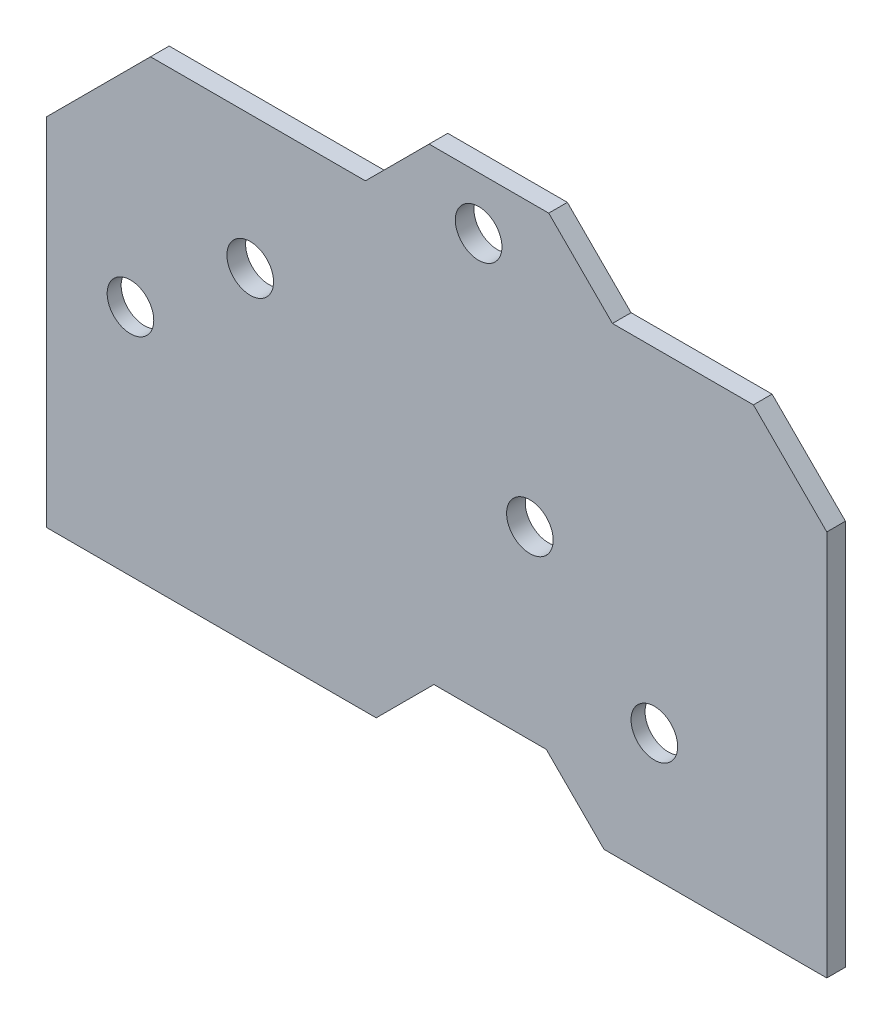
ISO-10303-21;
HEADER;
FILE_DESCRIPTION(('STEP AP214'),'2;1');
FILE_NAME('part.step','',(''),(''),'','','');
FILE_SCHEMA(('AUTOMOTIVE_DESIGN { 1 0 10303 214 1 1 1 1 }'));
ENDSEC;
DATA;
#1=APPLICATION_CONTEXT('core data for automotive mechanical design processes');
#2=APPLICATION_PROTOCOL_DEFINITION('international standard','automotive_design',2000,#1);
#3=PRODUCT_CONTEXT('',#1,'mechanical');
#4=PRODUCT('Part','Part','',(#3));
#5=PRODUCT_RELATED_PRODUCT_CATEGORY('part','',(#4));
#6=PRODUCT_DEFINITION_FORMATION('','',#4);
#7=PRODUCT_DEFINITION_CONTEXT('part definition',#1,'design');
#8=PRODUCT_DEFINITION('design','',#6,#7);
#9=PRODUCT_DEFINITION_SHAPE('','',#8);
#10=(LENGTH_UNIT() NAMED_UNIT(*) SI_UNIT(.MILLI.,.METRE.));
#11=(NAMED_UNIT(*) PLANE_ANGLE_UNIT() SI_UNIT($,.RADIAN.));
#12=(NAMED_UNIT(*) SI_UNIT($,.STERADIAN.) SOLID_ANGLE_UNIT());
#13=UNCERTAINTY_MEASURE_WITH_UNIT(LENGTH_MEASURE(1.E-05),#10,'distance_accuracy_value','');
#14=(GEOMETRIC_REPRESENTATION_CONTEXT(3) GLOBAL_UNCERTAINTY_ASSIGNED_CONTEXT((#13)) GLOBAL_UNIT_ASSIGNED_CONTEXT((#10,
#11,#12)) REPRESENTATION_CONTEXT('',''));
#15=CARTESIAN_POINT('',(0.,0.,0.));
#16=DIRECTION('',(0.,0.,1.));
#17=DIRECTION('',(1.,0.,0.));
#18=AXIS2_PLACEMENT_3D('',#15,#16,#17);
#19=CARTESIAN_POINT('',(22.1496803835065,-14.6968673144949,2.));
#20=DIRECTION('',(0.,0.,-1.));
#21=DIRECTION('',(-1.,0.,0.));
#22=AXIS2_PLACEMENT_3D('',#19,#20,#21);
#23=CYLINDRICAL_SURFACE('',#22,5.2);
#24=CARTESIAN_POINT('',(22.1496803835065,-14.6968673144949,0.));
#25=DIRECTION('',(0.,0.,1.));
#26=DIRECTION('',(1.,0.,0.));
#27=AXIS2_PLACEMENT_3D('',#24,#25,#26);
#28=CIRCLE('',#27,5.2);
#29=CARTESIAN_POINT('',(27.3496803835065,-14.6968673144949,0.));
#30=VERTEX_POINT('',#29);
#31=EDGE_CURVE('E164',#30,#30,#28,.T.);
#32=ORIENTED_EDGE('',*,*,#31,.F.);
#33=EDGE_LOOP('',(#32));
#34=FACE_BOUND('',#33,.T.);
#35=CARTESIAN_POINT('',(22.1496803835065,-14.6968673144949,0.5));
#36=DIRECTION('',(0.,0.,1.));
#37=DIRECTION('',(1.,0.,0.));
#38=AXIS2_PLACEMENT_3D('',#35,#36,#37);
#39=CIRCLE('',#38,5.2);
#40=CARTESIAN_POINT('',(27.3496803835065,-14.6968673144949,0.5));
#41=VERTEX_POINT('',#40);
#42=EDGE_CURVE('E320',#41,#41,#39,.T.);
#43=ORIENTED_EDGE('',*,*,#42,.T.);
#44=EDGE_LOOP('',(#43));
#45=FACE_BOUND('',#44,.T.);
#46=ADVANCED_FACE('F35',(#34,#45),#23,.F.);
#47=CARTESIAN_POINT('',(-34.0491875572135,-3.1968673144949,2.));
#48=DIRECTION('',(0.,0.,-1.));
#49=DIRECTION('',(-1.,0.,0.));
#50=AXIS2_PLACEMENT_3D('',#47,#48,#49);
#51=CYLINDRICAL_SURFACE('',#50,5.2);
#52=CARTESIAN_POINT('',(-34.0491875572135,-3.1968673144949,0.));
#53=DIRECTION('',(0.,0.,1.));
#54=DIRECTION('',(1.,0.,0.));
#55=AXIS2_PLACEMENT_3D('',#52,#53,#54);
#56=CIRCLE('',#55,5.2);
#57=CARTESIAN_POINT('',(-28.8491875572135,-3.1968673144949,0.));
#58=VERTEX_POINT('',#57);
#59=EDGE_CURVE('E167',#58,#58,#56,.T.);
#60=ORIENTED_EDGE('',*,*,#59,.F.);
#61=EDGE_LOOP('',(#60));
#62=FACE_BOUND('',#61,.T.);
#63=CARTESIAN_POINT('',(-34.0491875572135,-3.1968673144949,0.5));
#64=DIRECTION('',(0.,0.,1.));
#65=DIRECTION('',(1.,0.,0.));
#66=AXIS2_PLACEMENT_3D('',#63,#64,#65);
#67=CIRCLE('',#66,5.2);
#68=CARTESIAN_POINT('',(-28.8491875572135,-3.1968673144949,0.5));
#69=VERTEX_POINT('',#68);
#70=EDGE_CURVE('E168',#69,#69,#67,.T.);
#71=ORIENTED_EDGE('',*,*,#70,.T.);
#72=EDGE_LOOP('',(#71));
#73=FACE_BOUND('',#72,.T.);
#74=ADVANCED_FACE('F309',(#62,#73),#51,.F.);
#75=CARTESIAN_POINT('',(0.,21.1150266732983,2.));
#76=DIRECTION('',(0.,1.,0.));
#77=DIRECTION('',(0.,0.,1.));
#78=AXIS2_PLACEMENT_3D('',#75,#76,#77);
#79=PLANE('',#78);
#80=DIRECTION('',(1.,0.,0.));
#81=VECTOR('',#80,1.);
#82=CARTESIAN_POINT('',(0.,21.1150266732983,0.));
#83=LINE('',#82,#81);
#84=CARTESIAN_POINT('',(17.6551710420143,21.1150266732983,0.));
#85=VERTEX_POINT('',#84);
#86=CARTESIAN_POINT('',(32.7796989349296,21.1150266732983,0.));
#87=VERTEX_POINT('',#86);
#88=EDGE_CURVE('E180',#85,#87,#83,.T.);
#89=ORIENTED_EDGE('',*,*,#88,.F.);
#90=DIRECTION('',(0.,0.,-1.));
#91=VECTOR('',#90,1.);
#92=CARTESIAN_POINT('',(17.6551710420143,21.1150266732983,2.));
#93=LINE('',#92,#91);
#94=CARTESIAN_POINT('',(17.6551710420143,21.1150266732983,2.));
#95=VERTEX_POINT('',#94);
#96=EDGE_CURVE('E11',#95,#85,#93,.T.);
#97=ORIENTED_EDGE('',*,*,#96,.F.);
#98=DIRECTION('',(1.,0.,0.));
#99=VECTOR('',#98,1.);
#100=CARTESIAN_POINT('',(0.,21.1150266732983,2.));
#101=LINE('',#100,#99);
#102=CARTESIAN_POINT('',(32.7796989349296,21.1150266732983,2.));
#103=VERTEX_POINT('',#102);
#104=EDGE_CURVE('E269',#95,#103,#101,.T.);
#105=ORIENTED_EDGE('',*,*,#104,.T.);
#106=DIRECTION('',(0.,0.,-1.));
#107=VECTOR('',#106,1.);
#108=CARTESIAN_POINT('',(32.7796989349296,21.1150266732983,2.));
#109=LINE('',#108,#107);
#110=EDGE_CURVE('E51',#103,#87,#109,.T.);
#111=ORIENTED_EDGE('',*,*,#110,.T.);
#112=EDGE_LOOP('',(#89,#97,#105,#111));
#113=FACE_BOUND('',#112,.T.);
#114=ADVANCED_FACE('F314',(#113),#79,.T.);
#115=CARTESIAN_POINT('',(19.3850988576555,19.3850988576571,2.));
#116=DIRECTION('',(0.707106781186518,0.707106781186577,0.));
#117=DIRECTION('',(-0.707106781186577,0.707106781186518,0.));
#118=AXIS2_PLACEMENT_3D('',#115,#116,#117);
#119=PLANE('',#118);
#120=DIRECTION('',(0.707106781186577,-0.707106781186518,0.));
#121=VECTOR('',#120,1.);
#122=CARTESIAN_POINT('',(19.3850988576555,19.3850988576571,0.));
#123=LINE('',#122,#121);
#124=CARTESIAN_POINT('',(10.8212064054095,27.9489913099025,0.));
#125=VERTEX_POINT('',#124);
#126=EDGE_CURVE('E182',#125,#85,#123,.T.);
#127=ORIENTED_EDGE('',*,*,#126,.F.);
#128=DIRECTION('',(0.,0.,-1.));
#129=VECTOR('',#128,1.);
#130=CARTESIAN_POINT('',(10.8212064054095,27.9489913099025,2.));
#131=LINE('',#130,#129);
#132=CARTESIAN_POINT('',(10.8212064054095,27.9489913099025,2.));
#133=VERTEX_POINT('',#132);
#134=EDGE_CURVE('E43',#133,#125,#131,.T.);
#135=ORIENTED_EDGE('',*,*,#134,.F.);
#136=DIRECTION('',(0.707106781186577,-0.707106781186518,0.));
#137=VECTOR('',#136,1.);
#138=CARTESIAN_POINT('',(19.3850988576555,19.3850988576571,2.));
#139=LINE('',#138,#137);
#140=EDGE_CURVE('E267',#133,#95,#139,.T.);
#141=ORIENTED_EDGE('',*,*,#140,.T.);
#142=ORIENTED_EDGE('',*,*,#96,.T.);
#143=EDGE_LOOP('',(#127,#135,#141,#142));
#144=FACE_BOUND('',#143,.T.);
#145=ADVANCED_FACE('F254',(#144),#119,.T.);
#146=CARTESIAN_POINT('',(0.,27.9489913099025,2.));
#147=DIRECTION('',(0.,1.,0.));
#148=DIRECTION('',(0.,0.,1.));
#149=AXIS2_PLACEMENT_3D('',#146,#147,#148);
#150=PLANE('',#149);
#151=DIRECTION('',(1.,0.,0.));
#152=VECTOR('',#151,1.);
#153=CARTESIAN_POINT('',(0.,27.9489913099025,0.));
#154=LINE('',#153,#152);
#155=CARTESIAN_POINT('',(-2.01160423871102,27.9489913099025,0.));
#156=VERTEX_POINT('',#155);
#157=EDGE_CURVE('E185',#156,#125,#154,.T.);
#158=ORIENTED_EDGE('',*,*,#157,.F.);
#159=DIRECTION('',(0.,0.,-1.));
#160=VECTOR('',#159,1.);
#161=CARTESIAN_POINT('',(-2.01160423871102,27.9489913099025,2.));
#162=LINE('',#161,#160);
#163=CARTESIAN_POINT('',(-2.01160423871102,27.9489913099025,2.));
#164=VERTEX_POINT('',#163);
#165=EDGE_CURVE('E243',#164,#156,#162,.T.);
#166=ORIENTED_EDGE('',*,*,#165,.F.);
#167=DIRECTION('',(1.,0.,0.));
#168=VECTOR('',#167,1.);
#169=CARTESIAN_POINT('',(0.,27.9489913099025,2.));
#170=LINE('',#169,#168);
#171=EDGE_CURVE('E250',#164,#133,#170,.T.);
#172=ORIENTED_EDGE('',*,*,#171,.T.);
#173=ORIENTED_EDGE('',*,*,#134,.T.);
#174=EDGE_LOOP('',(#158,#166,#172,#173));
#175=FACE_BOUND('',#174,.T.);
#176=ADVANCED_FACE('F248',(#175),#150,.T.);
#177=CARTESIAN_POINT('',(-14.9802977743068,14.9802977743066,2.));
#178=DIRECTION('',(0.707106781186553,-0.707106781186543,0.));
#179=DIRECTION('',(0.707106781186543,0.707106781186553,0.));
#180=AXIS2_PLACEMENT_3D('',#177,#178,#179);
#181=PLANE('',#180);
#182=DIRECTION('',(-0.707106781186543,-0.707106781186553,0.));
#183=VECTOR('',#182,1.);
#184=CARTESIAN_POINT('',(-14.9802977743068,14.9802977743066,0.));
#185=LINE('',#184,#183);
#186=CARTESIAN_POINT('',(-8.8455688753147,21.1150266732987,0.));
#187=VERTEX_POINT('',#186);
#188=EDGE_CURVE('E188',#156,#187,#185,.T.);
#189=ORIENTED_EDGE('',*,*,#188,.T.);
#190=DIRECTION('',(0.,0.,-1.));
#191=VECTOR('',#190,1.);
#192=CARTESIAN_POINT('',(-8.8455688753147,21.1150266732987,2.));
#193=LINE('',#192,#191);
#194=CARTESIAN_POINT('',(-8.8455688753147,21.1150266732987,2.));
#195=VERTEX_POINT('',#194);
#196=EDGE_CURVE('E240',#195,#187,#193,.T.);
#197=ORIENTED_EDGE('',*,*,#196,.F.);
#198=DIRECTION('',(-0.707106781186543,-0.707106781186553,0.));
#199=VECTOR('',#198,1.);
#200=CARTESIAN_POINT('',(-14.9802977743068,14.9802977743066,2.));
#201=LINE('',#200,#199);
#202=EDGE_CURVE('E263',#164,#195,#201,.T.);
#203=ORIENTED_EDGE('',*,*,#202,.F.);
#204=ORIENTED_EDGE('',*,*,#165,.T.);
#205=EDGE_LOOP('',(#189,#197,#203,#204));
#206=FACE_BOUND('',#205,.T.);
#207=ADVANCED_FACE('F260',(#206),#181,.F.);
#208=CARTESIAN_POINT('',(0.,21.1150266732987,2.));
#209=DIRECTION('',(0.,-1.,0.));
#210=DIRECTION('',(1.,0.,0.));
#211=AXIS2_PLACEMENT_3D('',#208,#209,#210);
#212=PLANE('',#211);
#213=DIRECTION('',(-1.,0.,0.));
#214=VECTOR('',#213,1.);
#215=CARTESIAN_POINT('',(0.,21.1150266732987,0.));
#216=LINE('',#215,#214);
#217=CARTESIAN_POINT('',(-31.8983336413856,21.1150266732987,0.));
#218=VERTEX_POINT('',#217);
#219=EDGE_CURVE('E191',#187,#218,#216,.T.);
#220=ORIENTED_EDGE('',*,*,#219,.T.);
#221=DIRECTION('',(0.,0.,-1.));
#222=VECTOR('',#221,1.);
#223=CARTESIAN_POINT('',(-31.8983336413856,21.1150266732987,2.));
#224=LINE('',#223,#222);
#225=CARTESIAN_POINT('',(-31.8983336413856,21.1150266732987,2.));
#226=VERTEX_POINT('',#225);
#227=EDGE_CURVE('E237',#226,#218,#224,.T.);
#228=ORIENTED_EDGE('',*,*,#227,.F.);
#229=DIRECTION('',(-1.,0.,0.));
#230=VECTOR('',#229,1.);
#231=CARTESIAN_POINT('',(0.,21.1150266732987,2.));
#232=LINE('',#231,#230);
#233=EDGE_CURVE('E265',#195,#226,#232,.T.);
#234=ORIENTED_EDGE('',*,*,#233,.F.);
#235=ORIENTED_EDGE('',*,*,#196,.T.);
#236=EDGE_LOOP('',(#220,#228,#234,#235));
#237=FACE_BOUND('',#236,.T.);
#238=ADVANCED_FACE('F520',(#237),#212,.F.);
#239=CARTESIAN_POINT('',(-26.5066801573422,26.5066801573421,2.));
#240=DIRECTION('',(0.707106781186549,-0.707106781186546,0.));
#241=DIRECTION('',(0.707106781186546,0.707106781186549,0.));
#242=AXIS2_PLACEMENT_3D('',#239,#240,#241);
#243=PLANE('',#242);
#244=DIRECTION('',(-0.707106781186546,-0.707106781186549,0.));
#245=VECTOR('',#244,1.);
#246=CARTESIAN_POINT('',(-26.5066801573422,26.5066801573421,0.));
#247=LINE('',#246,#245);
#248=CARTESIAN_POINT('',(-43.0491875572135,9.96417275747066,0.));
#249=VERTEX_POINT('',#248);
#250=EDGE_CURVE('E194',#218,#249,#247,.T.);
#251=ORIENTED_EDGE('',*,*,#250,.T.);
#252=DIRECTION('',(0.,0.,-1.));
#253=VECTOR('',#252,1.);
#254=CARTESIAN_POINT('',(-43.0491875572135,9.96417275747066,2.));
#255=LINE('',#254,#253);
#256=CARTESIAN_POINT('',(-43.0491875572135,9.96417275747066,2.));
#257=VERTEX_POINT('',#256);
#258=EDGE_CURVE('E234',#257,#249,#255,.T.);
#259=ORIENTED_EDGE('',*,*,#258,.F.);
#260=DIRECTION('',(-0.707106781186546,-0.707106781186549,0.));
#261=VECTOR('',#260,1.);
#262=CARTESIAN_POINT('',(-26.5066801573422,26.5066801573421,2.));
#263=LINE('',#262,#261);
#264=EDGE_CURVE('E274',#226,#257,#263,.T.);
#265=ORIENTED_EDGE('',*,*,#264,.F.);
#266=ORIENTED_EDGE('',*,*,#227,.T.);
#267=EDGE_LOOP('',(#251,#259,#265,#266));
#268=FACE_BOUND('',#267,.T.);
#269=ADVANCED_FACE('F510',(#268),#243,.F.);
#270=CARTESIAN_POINT('',(-43.0491875572135,0.,2.));
#271=DIRECTION('',(1.,0.,0.));
#272=DIRECTION('',(0.,1.,0.));
#273=AXIS2_PLACEMENT_3D('',#270,#271,#272);
#274=PLANE('',#273);
#275=DIRECTION('',(0.,-1.,0.));
#276=VECTOR('',#275,1.);
#277=CARTESIAN_POINT('',(-43.0491875572135,0.,0.));
#278=LINE('',#277,#276);
#279=CARTESIAN_POINT('',(-43.0491875572135,-28.1968673144949,0.));
#280=VERTEX_POINT('',#279);
#281=EDGE_CURVE('E197',#249,#280,#278,.T.);
#282=ORIENTED_EDGE('',*,*,#281,.T.);
#283=DIRECTION('',(0.,0.,-1.));
#284=VECTOR('',#283,1.);
#285=CARTESIAN_POINT('',(-43.0491875572135,-28.1968673144949,2.));
#286=LINE('',#285,#284);
#287=CARTESIAN_POINT('',(-43.0491875572135,-28.1968673144949,2.));
#288=VERTEX_POINT('',#287);
#289=EDGE_CURVE('E231',#288,#280,#286,.T.);
#290=ORIENTED_EDGE('',*,*,#289,.F.);
#291=DIRECTION('',(0.,-1.,0.));
#292=VECTOR('',#291,1.);
#293=CARTESIAN_POINT('',(-43.0491875572135,0.,2.));
#294=LINE('',#293,#292);
#295=EDGE_CURVE('E277',#257,#288,#294,.T.);
#296=ORIENTED_EDGE('',*,*,#295,.F.);
#297=ORIENTED_EDGE('',*,*,#258,.T.);
#298=EDGE_LOOP('',(#282,#290,#296,#297));
#299=FACE_BOUND('',#298,.T.);
#300=ADVANCED_FACE('F500',(#299),#274,.F.);
#301=CARTESIAN_POINT('',(0.,-28.1968673144949,2.));
#302=DIRECTION('',(0.,1.,0.));
#303=DIRECTION('',(0.,0.,1.));
#304=AXIS2_PLACEMENT_3D('',#301,#302,#303);
#305=PLANE('',#304);
#306=DIRECTION('',(1.,0.,0.));
#307=VECTOR('',#306,1.);
#308=CARTESIAN_POINT('',(0.,-28.1968673144949,0.));
#309=LINE('',#308,#307);
#310=CARTESIAN_POINT('',(-7.6861892758127,-28.1968673144949,0.));
#311=VERTEX_POINT('',#310);
#312=EDGE_CURVE('E200',#280,#311,#309,.T.);
#313=ORIENTED_EDGE('',*,*,#312,.T.);
#314=DIRECTION('',(0.,0.,-1.));
#315=VECTOR('',#314,1.);
#316=CARTESIAN_POINT('',(-7.6861892758127,-28.1968673144949,2.));
#317=LINE('',#316,#315);
#318=CARTESIAN_POINT('',(-7.6861892758127,-28.1968673144949,2.));
#319=VERTEX_POINT('',#318);
#320=EDGE_CURVE('E228',#319,#311,#317,.T.);
#321=ORIENTED_EDGE('',*,*,#320,.F.);
#322=DIRECTION('',(1.,0.,0.));
#323=VECTOR('',#322,1.);
#324=CARTESIAN_POINT('',(0.,-28.1968673144949,2.));
#325=LINE('',#324,#323);
#326=EDGE_CURVE('E280',#288,#319,#325,.T.);
#327=ORIENTED_EDGE('',*,*,#326,.F.);
#328=ORIENTED_EDGE('',*,*,#289,.T.);
#329=EDGE_LOOP('',(#313,#321,#327,#328));
#330=FACE_BOUND('',#329,.T.);
#331=ADVANCED_FACE('F490',(#330),#305,.F.);
#332=CARTESIAN_POINT('',(10.2553390193411,-10.2553390193411,2.));
#333=DIRECTION('',(-0.707106781186547,0.707106781186548,0.));
#334=DIRECTION('',(-0.707106781186548,-0.707106781186547,0.));
#335=AXIS2_PLACEMENT_3D('',#332,#333,#334);
#336=PLANE('',#335);
#337=DIRECTION('',(0.707106781186548,0.707106781186547,0.));
#338=VECTOR('',#337,1.);
#339=CARTESIAN_POINT('',(10.2553390193411,-10.2553390193411,0.));
#340=LINE('',#339,#338);
#341=CARTESIAN_POINT('',(-1.49403331489108,-22.0047113535733,0.));
#342=VERTEX_POINT('',#341);
#343=EDGE_CURVE('E203',#311,#342,#340,.T.);
#344=ORIENTED_EDGE('',*,*,#343,.T.);
#345=DIRECTION('',(0.,0.,-1.));
#346=VECTOR('',#345,1.);
#347=CARTESIAN_POINT('',(-1.49403331489108,-22.0047113535733,2.));
#348=LINE('',#347,#346);
#349=CARTESIAN_POINT('',(-1.49403331489108,-22.0047113535733,2.));
#350=VERTEX_POINT('',#349);
#351=EDGE_CURVE('E225',#350,#342,#348,.T.);
#352=ORIENTED_EDGE('',*,*,#351,.F.);
#353=DIRECTION('',(0.707106781186548,0.707106781186547,0.));
#354=VECTOR('',#353,1.);
#355=CARTESIAN_POINT('',(10.2553390193411,-10.2553390193411,2.));
#356=LINE('',#355,#354);
#357=EDGE_CURVE('E283',#319,#350,#356,.T.);
#358=ORIENTED_EDGE('',*,*,#357,.F.);
#359=ORIENTED_EDGE('',*,*,#320,.T.);
#360=EDGE_LOOP('',(#344,#352,#358,#359));
#361=FACE_BOUND('',#360,.T.);
#362=ADVANCED_FACE('F481',(#361),#336,.F.);
#363=CARTESIAN_POINT('',(0.,-22.0047113535733,2.));
#364=DIRECTION('',(0.,1.,0.));
#365=DIRECTION('',(0.,0.,1.));
#366=AXIS2_PLACEMENT_3D('',#363,#364,#365);
#367=PLANE('',#366);
#368=DIRECTION('',(1.,0.,0.));
#369=VECTOR('',#368,1.);
#370=CARTESIAN_POINT('',(0.,-22.0047113535733,0.));
#371=LINE('',#370,#369);
#372=CARTESIAN_POINT('',(10.556633430517,-22.0047113535733,0.));
#373=VERTEX_POINT('',#372);
#374=EDGE_CURVE('E206',#342,#373,#371,.T.);
#375=ORIENTED_EDGE('',*,*,#374,.T.);
#376=DIRECTION('',(0.,0.,-1.));
#377=VECTOR('',#376,1.);
#378=CARTESIAN_POINT('',(10.556633430517,-22.0047113535733,2.));
#379=LINE('',#378,#377);
#380=CARTESIAN_POINT('',(10.556633430517,-22.0047113535733,2.));
#381=VERTEX_POINT('',#380);
#382=EDGE_CURVE('E222',#381,#373,#379,.T.);
#383=ORIENTED_EDGE('',*,*,#382,.F.);
#384=DIRECTION('',(1.,0.,0.));
#385=VECTOR('',#384,1.);
#386=CARTESIAN_POINT('',(0.,-22.0047113535733,2.));
#387=LINE('',#386,#385);
#388=EDGE_CURVE('E286',#350,#381,#387,.T.);
#389=ORIENTED_EDGE('',*,*,#388,.F.);
#390=ORIENTED_EDGE('',*,*,#351,.T.);
#391=EDGE_LOOP('',(#375,#383,#389,#390));
#392=FACE_BOUND('',#391,.T.);
#393=ADVANCED_FACE('F290',(#392),#367,.F.);
#394=CARTESIAN_POINT('',(-5.72403896152812,-5.72403896152812,2.));
#395=DIRECTION('',(0.707106781186547,0.707106781186548,0.));
#396=DIRECTION('',(-0.707106781186548,0.707106781186547,0.));
#397=AXIS2_PLACEMENT_3D('',#394,#395,#396);
#398=PLANE('',#397);
#399=DIRECTION('',(0.707106781186548,-0.707106781186547,0.));
#400=VECTOR('',#399,1.);
#401=CARTESIAN_POINT('',(-5.72403896152812,-5.72403896152812,0.));
#402=LINE('',#401,#400);
#403=CARTESIAN_POINT('',(16.7487893914387,-28.1968673144949,0.));
#404=VERTEX_POINT('',#403);
#405=EDGE_CURVE('E209',#373,#404,#402,.T.);
#406=ORIENTED_EDGE('',*,*,#405,.T.);
#407=DIRECTION('',(0.,0.,-1.));
#408=VECTOR('',#407,1.);
#409=CARTESIAN_POINT('',(16.7487893914387,-28.1968673144949,2.));
#410=LINE('',#409,#408);
#411=CARTESIAN_POINT('',(16.7487893914387,-28.1968673144949,2.));
#412=VERTEX_POINT('',#411);
#413=EDGE_CURVE('E156',#412,#404,#410,.T.);
#414=ORIENTED_EDGE('',*,*,#413,.F.);
#415=DIRECTION('',(0.707106781186548,-0.707106781186547,0.));
#416=VECTOR('',#415,1.);
#417=CARTESIAN_POINT('',(-5.72403896152812,-5.72403896152812,2.));
#418=LINE('',#417,#416);
#419=EDGE_CURVE('E145',#381,#412,#418,.T.);
#420=ORIENTED_EDGE('',*,*,#419,.F.);
#421=ORIENTED_EDGE('',*,*,#382,.T.);
#422=EDGE_LOOP('',(#406,#414,#420,#421));
#423=FACE_BOUND('',#422,.T.);
#424=ADVANCED_FACE('F292',(#423),#398,.F.);
#425=CARTESIAN_POINT('',(0.,-28.1968673144949,2.));
#426=DIRECTION('',(0.,1.,0.));
#427=DIRECTION('',(0.,0.,1.));
#428=AXIS2_PLACEMENT_3D('',#425,#426,#427);
#429=PLANE('',#428);
#430=DIRECTION('',(1.,0.,0.));
#431=VECTOR('',#430,1.);
#432=CARTESIAN_POINT('',(0.,-28.1968673144949,0.));
#433=LINE('',#432,#431);
#434=CARTESIAN_POINT('',(40.6496803835069,-28.1968673144949,0.));
#435=VERTEX_POINT('',#434);
#436=EDGE_CURVE('E153',#404,#435,#433,.T.);
#437=ORIENTED_EDGE('',*,*,#436,.T.);
#438=DIRECTION('',(0.,0.,-1.));
#439=VECTOR('',#438,1.);
#440=CARTESIAN_POINT('',(40.6496803835069,-28.1968673144949,2.));
#441=LINE('',#440,#439);
#442=CARTESIAN_POINT('',(40.6496803835069,-28.1968673144949,2.));
#443=VERTEX_POINT('',#442);
#444=EDGE_CURVE('E151',#443,#435,#441,.T.);
#445=ORIENTED_EDGE('',*,*,#444,.F.);
#446=DIRECTION('',(1.,0.,0.));
#447=VECTOR('',#446,1.);
#448=CARTESIAN_POINT('',(0.,-28.1968673144949,2.));
#449=LINE('',#448,#447);
#450=EDGE_CURVE('E137',#412,#443,#449,.T.);
#451=ORIENTED_EDGE('',*,*,#450,.F.);
#452=ORIENTED_EDGE('',*,*,#413,.T.);
#453=EDGE_LOOP('',(#437,#445,#451,#452));
#454=FACE_BOUND('',#453,.T.);
#455=ADVANCED_FACE('F152',(#454),#429,.F.);
#456=CARTESIAN_POINT('',(40.6496803835067,1.97381111576773E-13,2.));
#457=DIRECTION('',(1.,0.,0.));
#458=DIRECTION('',(0.,1.,0.));
#459=AXIS2_PLACEMENT_3D('',#456,#457,#458);
#460=PLANE('',#459);
#461=DIRECTION('',(0.,-1.,0.));
#462=VECTOR('',#461,1.);
#463=CARTESIAN_POINT('',(40.6496803835067,1.97381111576773E-13,0.));
#464=LINE('',#463,#462);
#465=CARTESIAN_POINT('',(40.6496803835067,13.2450452247211,0.));
#466=VERTEX_POINT('',#465);
#467=EDGE_CURVE('E213',#466,#435,#464,.T.);
#468=ORIENTED_EDGE('',*,*,#467,.F.);
#469=DIRECTION('',(0.,0.,-1.));
#470=VECTOR('',#469,1.);
#471=CARTESIAN_POINT('',(40.6496803835067,13.2450452247211,2.));
#472=LINE('',#471,#470);
#473=CARTESIAN_POINT('',(40.6496803835067,13.2450452247211,2.));
#474=VERTEX_POINT('',#473);
#475=EDGE_CURVE('E94',#474,#466,#472,.T.);
#476=ORIENTED_EDGE('',*,*,#475,.F.);
#477=DIRECTION('',(0.,-1.,0.));
#478=VECTOR('',#477,1.);
#479=CARTESIAN_POINT('',(40.6496803835067,1.97381111576773E-13,2.));
#480=LINE('',#479,#478);
#481=EDGE_CURVE('E143',#474,#443,#480,.T.);
#482=ORIENTED_EDGE('',*,*,#481,.T.);
#483=ORIENTED_EDGE('',*,*,#444,.T.);
#484=EDGE_LOOP('',(#468,#476,#482,#483));
#485=FACE_BOUND('',#484,.T.);
#486=ADVANCED_FACE('F158',(#485),#460,.T.);
#487=CARTESIAN_POINT('',(-21.1997535868538,6.8031326855051,2.));
#488=DIRECTION('',(0.,0.,-1.));
#489=DIRECTION('',(-1.,0.,0.));
#490=AXIS2_PLACEMENT_3D('',#487,#488,#489);
#491=CYLINDRICAL_SURFACE('',#490,2.5);
#492=CARTESIAN_POINT('',(-21.1997535868538,6.8031326855051,2.));
#493=DIRECTION('',(0.,0.,1.));
#494=DIRECTION('',(1.,0.,0.));
#495=AXIS2_PLACEMENT_3D('',#492,#493,#494);
#496=CIRCLE('',#495,2.5);
#497=CARTESIAN_POINT('',(-18.6997535868538,6.8031326855051,2.));
#498=VERTEX_POINT('',#497);
#499=EDGE_CURVE('E342',#498,#498,#496,.T.);
#500=ORIENTED_EDGE('',*,*,#499,.T.);
#501=EDGE_LOOP('',(#500));
#502=FACE_BOUND('',#501,.T.);
#503=CARTESIAN_POINT('',(-21.1997535868538,6.8031326855051,0.));
#504=DIRECTION('',(0.,0.,1.));
#505=DIRECTION('',(1.,0.,0.));
#506=AXIS2_PLACEMENT_3D('',#503,#504,#505);
#507=CIRCLE('',#506,2.5);
#508=CARTESIAN_POINT('',(-18.6997535868538,6.8031326855051,0.));
#509=VERTEX_POINT('',#508);
#510=EDGE_CURVE('E177',#509,#509,#507,.T.);
#511=ORIENTED_EDGE('',*,*,#510,.F.);
#512=EDGE_LOOP('',(#511));
#513=FACE_BOUND('',#512,.T.);
#514=ADVANCED_FACE('F352',(#502,#513),#491,.F.);
#515=CARTESIAN_POINT('',(3.30024641314618,22.3031326855051,2.));
#516=DIRECTION('',(0.,0.,-1.));
#517=DIRECTION('',(-1.,0.,0.));
#518=AXIS2_PLACEMENT_3D('',#515,#516,#517);
#519=CYLINDRICAL_SURFACE('',#518,2.5);
#520=CARTESIAN_POINT('',(3.30024641314618,22.3031326855051,2.));
#521=DIRECTION('',(0.,0.,1.));
#522=DIRECTION('',(1.,0.,0.));
#523=AXIS2_PLACEMENT_3D('',#520,#521,#522);
#524=CIRCLE('',#523,2.5);
#525=CARTESIAN_POINT('',(5.80024641314617,22.3031326855051,2.));
#526=VERTEX_POINT('',#525);
#527=EDGE_CURVE('E339',#526,#526,#524,.T.);
#528=ORIENTED_EDGE('',*,*,#527,.T.);
#529=EDGE_LOOP('',(#528));
#530=FACE_BOUND('',#529,.T.);
#531=CARTESIAN_POINT('',(3.30024641314618,22.3031326855051,0.));
#532=DIRECTION('',(0.,0.,1.));
#533=DIRECTION('',(1.,0.,0.));
#534=AXIS2_PLACEMENT_3D('',#531,#532,#533);
#535=CIRCLE('',#534,2.5);
#536=CARTESIAN_POINT('',(5.80024641314617,22.3031326855051,0.));
#537=VERTEX_POINT('',#536);
#538=EDGE_CURVE('E174',#537,#537,#535,.T.);
#539=ORIENTED_EDGE('',*,*,#538,.F.);
#540=EDGE_LOOP('',(#539));
#541=FACE_BOUND('',#540,.T.);
#542=ADVANCED_FACE('F303',(#530,#541),#519,.F.);
#543=CARTESIAN_POINT('',(8.80024641314618,-2.1968673144949,2.));
#544=DIRECTION('',(0.,0.,-1.));
#545=DIRECTION('',(-1.,0.,0.));
#546=AXIS2_PLACEMENT_3D('',#543,#544,#545);
#547=CYLINDRICAL_SURFACE('',#546,2.5);
#548=CARTESIAN_POINT('',(8.80024641314618,-2.1968673144949,2.));
#549=DIRECTION('',(0.,0.,1.));
#550=DIRECTION('',(1.,0.,0.));
#551=AXIS2_PLACEMENT_3D('',#548,#549,#550);
#552=CIRCLE('',#551,2.5);
#553=CARTESIAN_POINT('',(11.3002464131462,-2.1968673144949,2.));
#554=VERTEX_POINT('',#553);
#555=EDGE_CURVE('E218',#554,#554,#552,.T.);
#556=ORIENTED_EDGE('',*,*,#555,.T.);
#557=EDGE_LOOP('',(#556));
#558=FACE_BOUND('',#557,.T.);
#559=CARTESIAN_POINT('',(8.80024641314618,-2.1968673144949,0.));
#560=DIRECTION('',(0.,0.,1.));
#561=DIRECTION('',(1.,0.,0.));
#562=AXIS2_PLACEMENT_3D('',#559,#560,#561);
#563=CIRCLE('',#562,2.5);
#564=CARTESIAN_POINT('',(11.3002464131462,-2.1968673144949,0.));
#565=VERTEX_POINT('',#564);
#566=EDGE_CURVE('E171',#565,#565,#563,.T.);
#567=ORIENTED_EDGE('',*,*,#566,.F.);
#568=EDGE_LOOP('',(#567));
#569=FACE_BOUND('',#568,.T.);
#570=ADVANCED_FACE('F295',(#558,#569),#547,.F.);
#571=CARTESIAN_POINT('',(26.9473628041139,26.9473628041139,2.));
#572=DIRECTION('',(0.707106781186547,0.707106781186547,0.));
#573=DIRECTION('',(-0.707106781186548,0.707106781186548,0.));
#574=AXIS2_PLACEMENT_3D('',#571,#572,#573);
#575=PLANE('',#574);
#576=DIRECTION('',(0.707106781186548,-0.707106781186548,0.));
#577=VECTOR('',#576,1.);
#578=CARTESIAN_POINT('',(26.9473628041139,26.9473628041139,0.));
#579=LINE('',#578,#577);
#580=EDGE_CURVE('E215',#87,#466,#579,.T.);
#581=ORIENTED_EDGE('',*,*,#580,.F.);
#582=ORIENTED_EDGE('',*,*,#110,.F.);
#583=DIRECTION('',(0.707106781186548,-0.707106781186548,0.));
#584=VECTOR('',#583,1.);
#585=CARTESIAN_POINT('',(26.9473628041139,26.9473628041139,2.));
#586=LINE('',#585,#584);
#587=EDGE_CURVE('E159',#103,#474,#586,.T.);
#588=ORIENTED_EDGE('',*,*,#587,.T.);
#589=ORIENTED_EDGE('',*,*,#475,.T.);
#590=EDGE_LOOP('',(#581,#582,#588,#589));
#591=FACE_BOUND('',#590,.T.);
#592=ADVANCED_FACE('F293',(#591),#575,.T.);
#593=CARTESIAN_POINT('',(0.,0.,2.));
#594=DIRECTION('',(0.,0.,1.));
#595=DIRECTION('',(1.,0.,0.));
#596=AXIS2_PLACEMENT_3D('',#593,#594,#595);
#597=PLANE('',#596);
#598=ORIENTED_EDGE('',*,*,#555,.F.);
#599=EDGE_LOOP('',(#598));
#600=FACE_BOUND('',#599,.T.);
#601=ORIENTED_EDGE('',*,*,#527,.F.);
#602=EDGE_LOOP('',(#601));
#603=FACE_BOUND('',#602,.T.);
#604=ORIENTED_EDGE('',*,*,#499,.F.);
#605=EDGE_LOOP('',(#604));
#606=FACE_BOUND('',#605,.T.);
#607=ORIENTED_EDGE('',*,*,#104,.F.);
#608=ORIENTED_EDGE('',*,*,#140,.F.);
#609=ORIENTED_EDGE('',*,*,#171,.F.);
#610=ORIENTED_EDGE('',*,*,#202,.T.);
#611=ORIENTED_EDGE('',*,*,#233,.T.);
#612=ORIENTED_EDGE('',*,*,#264,.T.);
#613=ORIENTED_EDGE('',*,*,#295,.T.);
#614=ORIENTED_EDGE('',*,*,#326,.T.);
#615=ORIENTED_EDGE('',*,*,#357,.T.);
#616=ORIENTED_EDGE('',*,*,#388,.T.);
#617=ORIENTED_EDGE('',*,*,#419,.T.);
#618=ORIENTED_EDGE('',*,*,#450,.T.);
#619=ORIENTED_EDGE('',*,*,#481,.F.);
#620=ORIENTED_EDGE('',*,*,#587,.F.);
#621=EDGE_LOOP('',(#607,#608,#609,#610,#611,#612,#613,#614,#615,#616,#617,#618,#619,#620));
#622=FACE_BOUND('',#621,.T.);
#623=CARTESIAN_POINT('',(-34.0491875572135,-3.1968673144949,2.));
#624=DIRECTION('',(0.,0.,1.));
#625=DIRECTION('',(1.,0.,0.));
#626=AXIS2_PLACEMENT_3D('',#623,#624,#625);
#627=CIRCLE('',#626,2.5);
#628=CARTESIAN_POINT('',(-31.5491875572135,-3.1968673144949,2.));
#629=VERTEX_POINT('',#628);
#630=EDGE_CURVE('E322',#629,#629,#627,.T.);
#631=ORIENTED_EDGE('',*,*,#630,.F.);
#632=EDGE_LOOP('',(#631));
#633=FACE_BOUND('',#632,.T.);
#634=CARTESIAN_POINT('',(22.1496803835065,-14.6968673144949,2.));
#635=DIRECTION('',(0.,0.,1.));
#636=DIRECTION('',(1.,0.,0.));
#637=AXIS2_PLACEMENT_3D('',#634,#635,#636);
#638=CIRCLE('',#637,2.5);
#639=CARTESIAN_POINT('',(24.6496803835065,-14.6968673144949,2.));
#640=VERTEX_POINT('',#639);
#641=EDGE_CURVE('E329',#640,#640,#638,.T.);
#642=ORIENTED_EDGE('',*,*,#641,.F.);
#643=EDGE_LOOP('',(#642));
#644=FACE_BOUND('',#643,.T.);
#645=ADVANCED_FACE('F139',(#600,#603,#606,#622,#633,#644),#597,.T.);
#646=CARTESIAN_POINT('',(0.,0.,0.));
#647=DIRECTION('',(0.,0.,1.));
#648=DIRECTION('',(1.,0.,0.));
#649=AXIS2_PLACEMENT_3D('',#646,#647,#648);
#650=PLANE('',#649);
#651=ORIENTED_EDGE('',*,*,#31,.T.);
#652=EDGE_LOOP('',(#651));
#653=FACE_BOUND('',#652,.T.);
#654=ORIENTED_EDGE('',*,*,#59,.T.);
#655=EDGE_LOOP('',(#654));
#656=FACE_BOUND('',#655,.T.);
#657=ORIENTED_EDGE('',*,*,#566,.T.);
#658=EDGE_LOOP('',(#657));
#659=FACE_BOUND('',#658,.T.);
#660=ORIENTED_EDGE('',*,*,#538,.T.);
#661=EDGE_LOOP('',(#660));
#662=FACE_BOUND('',#661,.T.);
#663=ORIENTED_EDGE('',*,*,#510,.T.);
#664=EDGE_LOOP('',(#663));
#665=FACE_BOUND('',#664,.T.);
#666=ORIENTED_EDGE('',*,*,#88,.T.);
#667=ORIENTED_EDGE('',*,*,#580,.T.);
#668=ORIENTED_EDGE('',*,*,#467,.T.);
#669=ORIENTED_EDGE('',*,*,#436,.F.);
#670=ORIENTED_EDGE('',*,*,#405,.F.);
#671=ORIENTED_EDGE('',*,*,#374,.F.);
#672=ORIENTED_EDGE('',*,*,#343,.F.);
#673=ORIENTED_EDGE('',*,*,#312,.F.);
#674=ORIENTED_EDGE('',*,*,#281,.F.);
#675=ORIENTED_EDGE('',*,*,#250,.F.);
#676=ORIENTED_EDGE('',*,*,#219,.F.);
#677=ORIENTED_EDGE('',*,*,#188,.F.);
#678=ORIENTED_EDGE('',*,*,#157,.T.);
#679=ORIENTED_EDGE('',*,*,#126,.T.);
#680=EDGE_LOOP('',(#666,#667,#668,#669,#670,#671,#672,#673,#674,#675,#676,#677,#678,#679));
#681=FACE_BOUND('',#680,.T.);
#682=ADVANCED_FACE('F257',(#653,#656,#659,#662,#665,#681),#650,.F.);
#683=CARTESIAN_POINT('',(-34.0491875572135,-3.1968673144949,0.5));
#684=DIRECTION('',(0.,0.,1.));
#685=DIRECTION('',(1.,0.,0.));
#686=AXIS2_PLACEMENT_3D('',#683,#684,#685);
#687=PLANE('',#686);
#688=CARTESIAN_POINT('',(-34.0491875572135,-3.1968673144949,0.5));
#689=DIRECTION('',(0.,0.,1.));
#690=DIRECTION('',(1.,0.,0.));
#691=AXIS2_PLACEMENT_3D('',#688,#689,#690);
#692=CIRCLE('',#691,2.5);
#693=CARTESIAN_POINT('',(-31.5491875572135,-3.1968673144949,0.5));
#694=VERTEX_POINT('',#693);
#695=EDGE_CURVE('E326',#694,#694,#692,.T.);
#696=ORIENTED_EDGE('',*,*,#695,.T.);
#697=EDGE_LOOP('',(#696));
#698=FACE_BOUND('',#697,.T.);
#699=ORIENTED_EDGE('',*,*,#70,.F.);
#700=EDGE_LOOP('',(#699));
#701=FACE_BOUND('',#700,.T.);
#702=ADVANCED_FACE('F366',(#698,#701),#687,.F.);
#703=CARTESIAN_POINT('',(-34.0491875572135,-3.1968673144949,0.5));
#704=DIRECTION('',(0.,0.,1.));
#705=DIRECTION('',(1.,0.,0.));
#706=AXIS2_PLACEMENT_3D('',#703,#704,#705);
#707=CYLINDRICAL_SURFACE('',#706,2.5);
#708=ORIENTED_EDGE('',*,*,#695,.F.);
#709=EDGE_LOOP('',(#708));
#710=FACE_BOUND('',#709,.T.);
#711=ORIENTED_EDGE('',*,*,#630,.T.);
#712=EDGE_LOOP('',(#711));
#713=FACE_BOUND('',#712,.T.);
#714=ADVANCED_FACE('F373',(#710,#713),#707,.F.);
#715=CARTESIAN_POINT('',(22.1496803835065,-14.6968673144949,0.5));
#716=DIRECTION('',(0.,0.,1.));
#717=DIRECTION('',(1.,0.,0.));
#718=AXIS2_PLACEMENT_3D('',#715,#716,#717);
#719=PLANE('',#718);
#720=CARTESIAN_POINT('',(22.1496803835065,-14.6968673144949,0.5));
#721=DIRECTION('',(0.,0.,1.));
#722=DIRECTION('',(1.,0.,0.));
#723=AXIS2_PLACEMENT_3D('',#720,#721,#722);
#724=CIRCLE('',#723,2.5);
#725=CARTESIAN_POINT('',(24.6496803835065,-14.6968673144949,0.5));
#726=VERTEX_POINT('',#725);
#727=EDGE_CURVE('E323',#726,#726,#724,.T.);
#728=ORIENTED_EDGE('',*,*,#727,.T.);
#729=EDGE_LOOP('',(#728));
#730=FACE_BOUND('',#729,.T.);
#731=ORIENTED_EDGE('',*,*,#42,.F.);
#732=EDGE_LOOP('',(#731));
#733=FACE_BOUND('',#732,.T.);
#734=ADVANCED_FACE('F380',(#730,#733),#719,.F.);
#735=CARTESIAN_POINT('',(22.1496803835065,-14.6968673144949,0.5));
#736=DIRECTION('',(0.,0.,1.));
#737=DIRECTION('',(1.,0.,0.));
#738=AXIS2_PLACEMENT_3D('',#735,#736,#737);
#739=CYLINDRICAL_SURFACE('',#738,2.5);
#740=ORIENTED_EDGE('',*,*,#727,.F.);
#741=EDGE_LOOP('',(#740));
#742=FACE_BOUND('',#741,.T.);
#743=ORIENTED_EDGE('',*,*,#641,.T.);
#744=EDGE_LOOP('',(#743));
#745=FACE_BOUND('',#744,.T.);
#746=ADVANCED_FACE('F384',(#742,#745),#739,.F.);
#747=CLOSED_SHELL('',(#46,#74,#114,#145,#176,#207,#238,#269,#300,#331,#362,#393,#424,#455,#486,
#514,#542,#570,#592,#645,#682,#702,#714,#734,#746));
#748=MANIFOLD_SOLID_BREP('B2',#747);
#749=ADVANCED_BREP_SHAPE_REPRESENTATION('',(#18,#748),#14);
#750=SHAPE_DEFINITION_REPRESENTATION(#9,#749);
ENDSEC;
END-ISO-10303-21;
